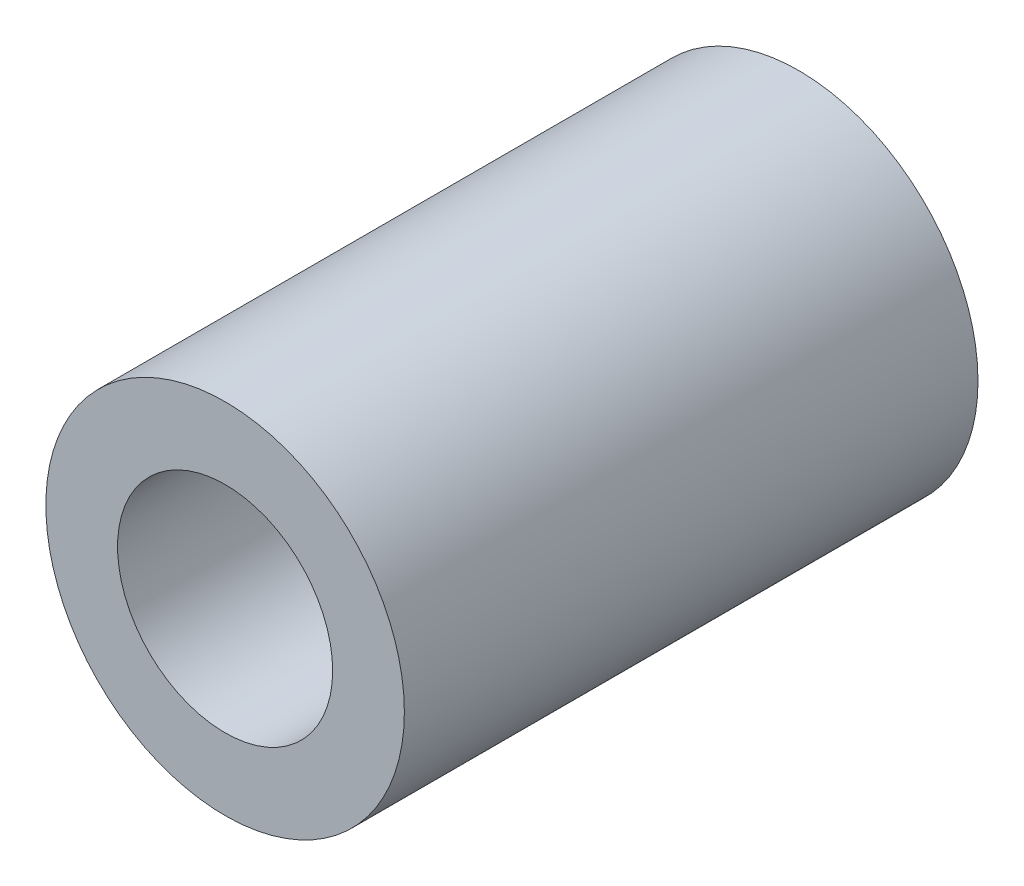
ISO-10303-21;
HEADER;
FILE_DESCRIPTION(('STEP AP214'),'2;1');
FILE_NAME('part.step','',(''),(''),'','','');
FILE_SCHEMA(('AUTOMOTIVE_DESIGN { 1 0 10303 214 1 1 1 1 }'));
ENDSEC;
DATA;
#1=APPLICATION_CONTEXT('core data for automotive mechanical design processes');
#2=APPLICATION_PROTOCOL_DEFINITION('international standard','automotive_design',2000,#1);
#3=PRODUCT_CONTEXT('',#1,'mechanical');
#4=PRODUCT('Part','Part','',(#3));
#5=PRODUCT_RELATED_PRODUCT_CATEGORY('part','',(#4));
#6=PRODUCT_DEFINITION_FORMATION('','',#4);
#7=PRODUCT_DEFINITION_CONTEXT('part definition',#1,'design');
#8=PRODUCT_DEFINITION('design','',#6,#7);
#9=PRODUCT_DEFINITION_SHAPE('','',#8);
#10=(LENGTH_UNIT() NAMED_UNIT(*) SI_UNIT(.MILLI.,.METRE.));
#11=(NAMED_UNIT(*) PLANE_ANGLE_UNIT() SI_UNIT($,.RADIAN.));
#12=(NAMED_UNIT(*) SI_UNIT($,.STERADIAN.) SOLID_ANGLE_UNIT());
#13=UNCERTAINTY_MEASURE_WITH_UNIT(LENGTH_MEASURE(1.E-05),#10,'distance_accuracy_value','');
#14=(GEOMETRIC_REPRESENTATION_CONTEXT(3) GLOBAL_UNCERTAINTY_ASSIGNED_CONTEXT((#13)) GLOBAL_UNIT_ASSIGNED_CONTEXT((#10,
#11,#12)) REPRESENTATION_CONTEXT('',''));
#15=CARTESIAN_POINT('',(0.,0.,0.));
#16=DIRECTION('',(0.,0.,1.));
#17=DIRECTION('',(1.,0.,0.));
#18=AXIS2_PLACEMENT_3D('',#15,#16,#17);
#19=CARTESIAN_POINT('',(0.,0.,12.7));
#20=DIRECTION('',(0.,0.,1.));
#21=DIRECTION('',(1.,0.,0.));
#22=AXIS2_PLACEMENT_3D('',#19,#20,#21);
#23=PLANE('',#22);
#24=CARTESIAN_POINT('',(0.,0.,12.7));
#25=DIRECTION('',(0.,0.,1.));
#26=DIRECTION('',(1.,0.,0.));
#27=AXIS2_PLACEMENT_3D('',#24,#25,#26);
#28=CIRCLE('',#27,3.96875000000002);
#29=CARTESIAN_POINT('',(3.96875000000002,0.,12.7));
#30=VERTEX_POINT('',#29);
#31=EDGE_CURVE('E10',#30,#30,#28,.T.);
#32=ORIENTED_EDGE('',*,*,#31,.T.);
#33=EDGE_LOOP('',(#32));
#34=FACE_BOUND('',#33,.T.);
#35=CARTESIAN_POINT('',(0.,0.,12.7));
#36=DIRECTION('',(0.,0.,1.));
#37=DIRECTION('',(1.,0.,0.));
#38=AXIS2_PLACEMENT_3D('',#35,#36,#37);
#39=CIRCLE('',#38,2.38125);
#40=CARTESIAN_POINT('',(2.38125,0.,12.7));
#41=VERTEX_POINT('',#40);
#42=EDGE_CURVE('E41',#41,#41,#39,.T.);
#43=ORIENTED_EDGE('',*,*,#42,.F.);
#44=EDGE_LOOP('',(#43));
#45=FACE_BOUND('',#44,.T.);
#46=ADVANCED_FACE('F30',(#34,#45),#23,.T.);
#47=CARTESIAN_POINT('',(0.,0.,0.));
#48=DIRECTION('',(0.,0.,1.));
#49=DIRECTION('',(1.,0.,0.));
#50=AXIS2_PLACEMENT_3D('',#47,#48,#49);
#51=PLANE('',#50);
#52=CARTESIAN_POINT('',(0.,0.,0.));
#53=DIRECTION('',(0.,0.,1.));
#54=DIRECTION('',(1.,0.,0.));
#55=AXIS2_PLACEMENT_3D('',#52,#53,#54);
#56=CIRCLE('',#55,3.96875000000002);
#57=CARTESIAN_POINT('',(3.96875000000002,0.,0.));
#58=VERTEX_POINT('',#57);
#59=EDGE_CURVE('E34',#58,#58,#56,.T.);
#60=ORIENTED_EDGE('',*,*,#59,.F.);
#61=EDGE_LOOP('',(#60));
#62=FACE_BOUND('',#61,.T.);
#63=CARTESIAN_POINT('',(0.,0.,0.));
#64=DIRECTION('',(0.,0.,1.));
#65=DIRECTION('',(1.,0.,0.));
#66=AXIS2_PLACEMENT_3D('',#63,#64,#65);
#67=CIRCLE('',#66,2.38125);
#68=CARTESIAN_POINT('',(2.38125,0.,0.));
#69=VERTEX_POINT('',#68);
#70=EDGE_CURVE('E43',#69,#69,#67,.T.);
#71=ORIENTED_EDGE('',*,*,#70,.T.);
#72=EDGE_LOOP('',(#71));
#73=FACE_BOUND('',#72,.T.);
#74=ADVANCED_FACE('F53',(#62,#73),#51,.F.);
#75=CARTESIAN_POINT('',(0.,0.,12.7));
#76=DIRECTION('',(0.,0.,-1.));
#77=DIRECTION('',(-1.,0.,0.));
#78=AXIS2_PLACEMENT_3D('',#75,#76,#77);
#79=CYLINDRICAL_SURFACE('',#78,3.96875000000002);
#80=ORIENTED_EDGE('',*,*,#31,.F.);
#81=EDGE_LOOP('',(#80));
#82=FACE_BOUND('',#81,.T.);
#83=ORIENTED_EDGE('',*,*,#59,.T.);
#84=EDGE_LOOP('',(#83));
#85=FACE_BOUND('',#84,.T.);
#86=ADVANCED_FACE('F32',(#82,#85),#79,.T.);
#87=CARTESIAN_POINT('',(0.,0.,12.7));
#88=DIRECTION('',(0.,0.,-1.));
#89=DIRECTION('',(-1.,0.,0.));
#90=AXIS2_PLACEMENT_3D('',#87,#88,#89);
#91=CYLINDRICAL_SURFACE('',#90,2.38125);
#92=ORIENTED_EDGE('',*,*,#42,.T.);
#93=EDGE_LOOP('',(#92));
#94=FACE_BOUND('',#93,.T.);
#95=ORIENTED_EDGE('',*,*,#70,.F.);
#96=EDGE_LOOP('',(#95));
#97=FACE_BOUND('',#96,.T.);
#98=ADVANCED_FACE('F49',(#94,#97),#91,.F.);
#99=CLOSED_SHELL('',(#46,#74,#86,#98));
#100=MANIFOLD_SOLID_BREP('B2',#99);
#101=ADVANCED_BREP_SHAPE_REPRESENTATION('',(#18,#100),#14);
#102=SHAPE_DEFINITION_REPRESENTATION(#9,#101);
ENDSEC;
END-ISO-10303-21;
